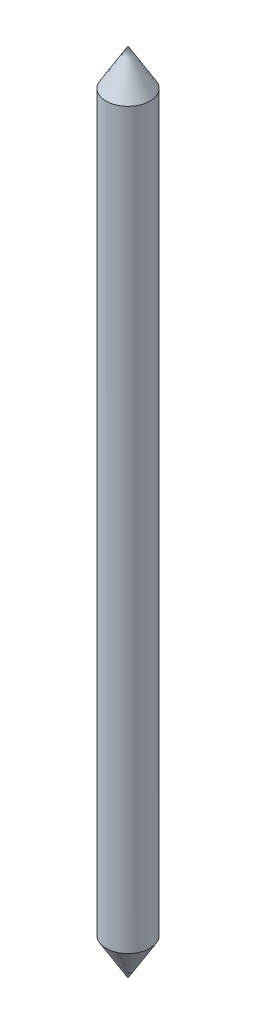
ISO-10303-21;
HEADER;
FILE_DESCRIPTION(('STEP AP214'),'2;1');
FILE_NAME('part.step','',(''),(''),'','','');
FILE_SCHEMA(('AUTOMOTIVE_DESIGN { 1 0 10303 214 1 1 1 1 }'));
ENDSEC;
DATA;
#1=APPLICATION_CONTEXT('core data for automotive mechanical design processes');
#2=APPLICATION_PROTOCOL_DEFINITION('international standard','automotive_design',2000,#1);
#3=PRODUCT_CONTEXT('',#1,'mechanical');
#4=PRODUCT('Part','Part','',(#3));
#5=PRODUCT_RELATED_PRODUCT_CATEGORY('part','',(#4));
#6=PRODUCT_DEFINITION_FORMATION('','',#4);
#7=PRODUCT_DEFINITION_CONTEXT('part definition',#1,'design');
#8=PRODUCT_DEFINITION('design','',#6,#7);
#9=PRODUCT_DEFINITION_SHAPE('','',#8);
#10=(LENGTH_UNIT() NAMED_UNIT(*) SI_UNIT(.MILLI.,.METRE.));
#11=(NAMED_UNIT(*) PLANE_ANGLE_UNIT() SI_UNIT($,.RADIAN.));
#12=(NAMED_UNIT(*) SI_UNIT($,.STERADIAN.) SOLID_ANGLE_UNIT());
#13=UNCERTAINTY_MEASURE_WITH_UNIT(LENGTH_MEASURE(1.E-05),#10,'distance_accuracy_value','');
#14=(GEOMETRIC_REPRESENTATION_CONTEXT(3) GLOBAL_UNCERTAINTY_ASSIGNED_CONTEXT((#13)) GLOBAL_UNIT_ASSIGNED_CONTEXT((#10,
#11,#12)) REPRESENTATION_CONTEXT('',''));
#15=CARTESIAN_POINT('',(0.,0.,0.));
#16=DIRECTION('',(0.,0.,1.));
#17=DIRECTION('',(1.,0.,0.));
#18=AXIS2_PLACEMENT_3D('',#15,#16,#17);
#19=CARTESIAN_POINT('',(0.,-139.7,0.));
#20=DIRECTION('',(0.,1.,0.));
#21=DIRECTION('',(0.,0.,1.));
#22=AXIS2_PLACEMENT_3D('',#19,#20,#21);
#23=CONICAL_SURFACE('',#22,0.,0.540419500270587);
#24=CARTESIAN_POINT('',(0.,-127.,0.));
#25=DIRECTION('',(0.,-1.,0.));
#26=DIRECTION('',(0.,0.,-1.));
#27=AXIS2_PLACEMENT_3D('',#24,#25,#26);
#28=CIRCLE('',#27,7.62000000000005);
#29=CARTESIAN_POINT('',(0.,-127.,-7.62000000000004));
#30=VERTEX_POINT('',#29);
#31=EDGE_CURVE('E11',#30,#30,#28,.T.);
#32=ORIENTED_EDGE('',*,*,#31,.T.);
#33=EDGE_LOOP('',(#32));
#34=FACE_BOUND('',#33,.T.);
#35=CARTESIAN_POINT('',(0.,-139.7,0.));
#36=VERTEX_POINT('',#35);
#37=VERTEX_LOOP('',#36);
#38=FACE_BOUND('',#37,.T.);
#39=ADVANCED_FACE('F42',(#34,#38),#23,.T.);
#40=CARTESIAN_POINT('',(0.,-139.7,0.));
#41=DIRECTION('',(0.,-1.,0.));
#42=DIRECTION('',(0.,0.,-1.));
#43=AXIS2_PLACEMENT_3D('',#40,#41,#42);
#44=CYLINDRICAL_SURFACE('',#43,7.62000000000007);
#45=CARTESIAN_POINT('',(0.,127.,0.));
#46=DIRECTION('',(0.,-1.,0.));
#47=DIRECTION('',(0.,0.,-1.));
#48=AXIS2_PLACEMENT_3D('',#45,#46,#47);
#49=CIRCLE('',#48,7.6200000000001);
#50=CARTESIAN_POINT('',(0.,127.,-7.62000000000004));
#51=VERTEX_POINT('',#50);
#52=EDGE_CURVE('E49',#51,#51,#49,.T.);
#53=ORIENTED_EDGE('',*,*,#52,.T.);
#54=EDGE_LOOP('',(#53));
#55=FACE_BOUND('',#54,.T.);
#56=ORIENTED_EDGE('',*,*,#31,.F.);
#57=EDGE_LOOP('',(#56));
#58=FACE_BOUND('',#57,.T.);
#59=ADVANCED_FACE('F58',(#55,#58),#44,.T.);
#60=CARTESIAN_POINT('',(0.,127.,0.));
#61=DIRECTION('',(0.,-1.,0.));
#62=DIRECTION('',(0.,0.,-1.));
#63=AXIS2_PLACEMENT_3D('',#60,#61,#62);
#64=CONICAL_SURFACE('',#63,7.6200000000001,0.54041950027059);
#65=CARTESIAN_POINT('',(0.,139.7,0.));
#66=VERTEX_POINT('',#65);
#67=VERTEX_LOOP('',#66);
#68=FACE_BOUND('',#67,.T.);
#69=ORIENTED_EDGE('',*,*,#52,.F.);
#70=EDGE_LOOP('',(#69));
#71=FACE_BOUND('',#70,.T.);
#72=ADVANCED_FACE('F55',(#68,#71),#64,.T.);
#73=CLOSED_SHELL('',(#39,#59,#72));
#74=MANIFOLD_SOLID_BREP('B2',#73);
#75=ADVANCED_BREP_SHAPE_REPRESENTATION('',(#18,#74),#14);
#76=SHAPE_DEFINITION_REPRESENTATION(#9,#75);
ENDSEC;
END-ISO-10303-21;
